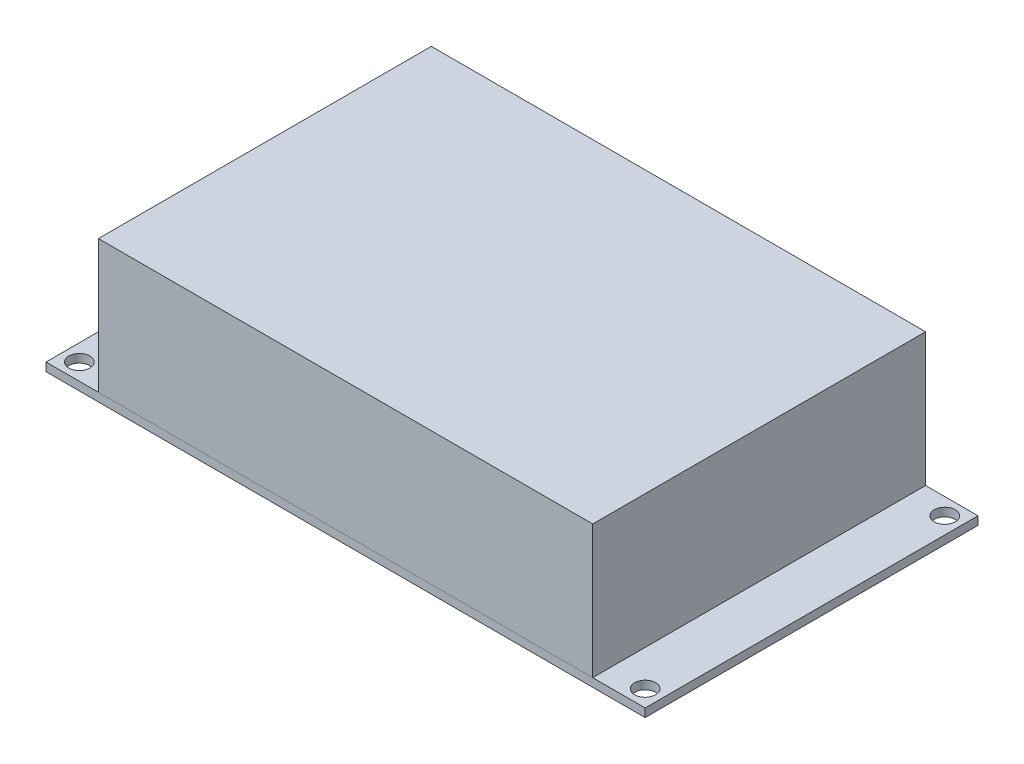
ISO-10303-21;
HEADER;
FILE_DESCRIPTION(('STEP AP214'),'2;1');
FILE_NAME('part.step','',(''),(''),'','','');
FILE_SCHEMA(('AUTOMOTIVE_DESIGN { 1 0 10303 214 1 1 1 1 }'));
ENDSEC;
DATA;
#1=APPLICATION_CONTEXT('core data for automotive mechanical design processes');
#2=APPLICATION_PROTOCOL_DEFINITION('international standard','automotive_design',2000,#1);
#3=PRODUCT_CONTEXT('',#1,'mechanical');
#4=PRODUCT('Part','Part','',(#3));
#5=PRODUCT_RELATED_PRODUCT_CATEGORY('part','',(#4));
#6=PRODUCT_DEFINITION_FORMATION('','',#4);
#7=PRODUCT_DEFINITION_CONTEXT('part definition',#1,'design');
#8=PRODUCT_DEFINITION('design','',#6,#7);
#9=PRODUCT_DEFINITION_SHAPE('','',#8);
#10=(LENGTH_UNIT() NAMED_UNIT(*) SI_UNIT(.MILLI.,.METRE.));
#11=(NAMED_UNIT(*) PLANE_ANGLE_UNIT() SI_UNIT($,.RADIAN.));
#12=(NAMED_UNIT(*) SI_UNIT($,.STERADIAN.) SOLID_ANGLE_UNIT());
#13=UNCERTAINTY_MEASURE_WITH_UNIT(LENGTH_MEASURE(1.E-05),#10,'distance_accuracy_value','');
#14=(GEOMETRIC_REPRESENTATION_CONTEXT(3) GLOBAL_UNCERTAINTY_ASSIGNED_CONTEXT((#13)) GLOBAL_UNIT_ASSIGNED_CONTEXT((#10,
#11,#12)) REPRESENTATION_CONTEXT('',''));
#15=CARTESIAN_POINT('',(0.,0.,0.));
#16=DIRECTION('',(0.,0.,1.));
#17=DIRECTION('',(1.,0.,0.));
#18=AXIS2_PLACEMENT_3D('',#15,#16,#17);
#19=CARTESIAN_POINT('',(10.,27.,0.));
#20=DIRECTION('',(0.,0.,-1.));
#21=DIRECTION('',(-1.,0.,0.));
#22=AXIS2_PLACEMENT_3D('',#19,#20,#21);
#23=PLANE('',#22);
#24=DIRECTION('',(1.,0.,0.));
#25=VECTOR('',#24,1.);
#26=CARTESIAN_POINT('',(10.,1.6,0.));
#27=LINE('',#26,#25);
#28=CARTESIAN_POINT('',(10.,1.6,0.));
#29=VERTEX_POINT('',#28);
#30=CARTESIAN_POINT('',(104.3,1.6,0.));
#31=VERTEX_POINT('',#30);
#32=EDGE_CURVE('E90',#29,#31,#27,.T.);
#33=ORIENTED_EDGE('',*,*,#32,.T.);
#34=DIRECTION('',(0.,-1.,0.));
#35=VECTOR('',#34,1.);
#36=CARTESIAN_POINT('',(104.3,27.,0.));
#37=LINE('',#36,#35);
#38=CARTESIAN_POINT('',(104.3,27.,0.));
#39=VERTEX_POINT('',#38);
#40=EDGE_CURVE('E12',#39,#31,#37,.T.);
#41=ORIENTED_EDGE('',*,*,#40,.F.);
#42=DIRECTION('',(1.,0.,0.));
#43=VECTOR('',#42,1.);
#44=CARTESIAN_POINT('',(10.,27.,0.));
#45=LINE('',#44,#43);
#46=CARTESIAN_POINT('',(10.,27.,0.));
#47=VERTEX_POINT('',#46);
#48=EDGE_CURVE('E108',#47,#39,#45,.T.);
#49=ORIENTED_EDGE('',*,*,#48,.F.);
#50=DIRECTION('',(0.,-1.,0.));
#51=VECTOR('',#50,1.);
#52=CARTESIAN_POINT('',(10.,27.,0.));
#53=LINE('',#52,#51);
#54=EDGE_CURVE('E102',#47,#29,#53,.T.);
#55=ORIENTED_EDGE('',*,*,#54,.T.);
#56=EDGE_LOOP('',(#33,#41,#49,#55));
#57=FACE_BOUND('',#56,.T.);
#58=ADVANCED_FACE('F46',(#57),#23,.F.);
#59=CARTESIAN_POINT('',(104.3,27.,-63.5));
#60=DIRECTION('',(-1.,0.,0.));
#61=DIRECTION('',(0.,0.,1.));
#62=AXIS2_PLACEMENT_3D('',#59,#60,#61);
#63=PLANE('',#62);
#64=DIRECTION('',(0.,0.,-1.));
#65=VECTOR('',#64,1.);
#66=CARTESIAN_POINT('',(104.3,1.6,-63.5));
#67=LINE('',#66,#65);
#68=CARTESIAN_POINT('',(104.3,1.6,-63.5));
#69=VERTEX_POINT('',#68);
#70=EDGE_CURVE('E86',#31,#69,#67,.T.);
#71=ORIENTED_EDGE('',*,*,#70,.T.);
#72=DIRECTION('',(0.,-1.,0.));
#73=VECTOR('',#72,1.);
#74=CARTESIAN_POINT('',(104.3,27.,-63.5));
#75=LINE('',#74,#73);
#76=CARTESIAN_POINT('',(104.3,27.,-63.5));
#77=VERTEX_POINT('',#76);
#78=EDGE_CURVE('E53',#77,#69,#75,.T.);
#79=ORIENTED_EDGE('',*,*,#78,.F.);
#80=DIRECTION('',(0.,0.,-1.));
#81=VECTOR('',#80,1.);
#82=CARTESIAN_POINT('',(104.3,27.,-63.5));
#83=LINE('',#82,#81);
#84=EDGE_CURVE('E98',#39,#77,#83,.T.);
#85=ORIENTED_EDGE('',*,*,#84,.F.);
#86=ORIENTED_EDGE('',*,*,#40,.T.);
#87=EDGE_LOOP('',(#71,#79,#85,#86));
#88=FACE_BOUND('',#87,.T.);
#89=ADVANCED_FACE('F97',(#88),#63,.F.);
#90=CARTESIAN_POINT('',(104.3,27.,-63.5));
#91=DIRECTION('',(0.,0.,1.));
#92=DIRECTION('',(1.,0.,0.));
#93=AXIS2_PLACEMENT_3D('',#90,#91,#92);
#94=PLANE('',#93);
#95=DIRECTION('',(-1.,0.,0.));
#96=VECTOR('',#95,1.);
#97=CARTESIAN_POINT('',(104.3,1.6,-63.5));
#98=LINE('',#97,#96);
#99=CARTESIAN_POINT('',(10.,1.6,-63.5));
#100=VERTEX_POINT('',#99);
#101=EDGE_CURVE('E91',#69,#100,#98,.T.);
#102=ORIENTED_EDGE('',*,*,#101,.T.);
#103=DIRECTION('',(0.,-1.,0.));
#104=VECTOR('',#103,1.);
#105=CARTESIAN_POINT('',(10.,27.,-63.5));
#106=LINE('',#105,#104);
#107=CARTESIAN_POINT('',(10.,27.,-63.5));
#108=VERTEX_POINT('',#107);
#109=EDGE_CURVE('E114',#108,#100,#106,.T.);
#110=ORIENTED_EDGE('',*,*,#109,.F.);
#111=DIRECTION('',(-1.,0.,0.));
#112=VECTOR('',#111,1.);
#113=CARTESIAN_POINT('',(104.3,27.,-63.5));
#114=LINE('',#113,#112);
#115=EDGE_CURVE('E65',#77,#108,#114,.T.);
#116=ORIENTED_EDGE('',*,*,#115,.F.);
#117=ORIENTED_EDGE('',*,*,#78,.T.);
#118=EDGE_LOOP('',(#102,#110,#116,#117));
#119=FACE_BOUND('',#118,.T.);
#120=ADVANCED_FACE('F117',(#119),#94,.F.);
#121=CARTESIAN_POINT('',(10.,27.,-63.5));
#122=DIRECTION('',(1.,0.,0.));
#123=DIRECTION('',(0.,0.,-1.));
#124=AXIS2_PLACEMENT_3D('',#121,#122,#123);
#125=PLANE('',#124);
#126=DIRECTION('',(0.,0.,1.));
#127=VECTOR('',#126,1.);
#128=CARTESIAN_POINT('',(10.,1.6,-63.5));
#129=LINE('',#128,#127);
#130=EDGE_CURVE('E106',#100,#29,#129,.T.);
#131=ORIENTED_EDGE('',*,*,#130,.T.);
#132=ORIENTED_EDGE('',*,*,#54,.F.);
#133=DIRECTION('',(0.,0.,1.));
#134=VECTOR('',#133,1.);
#135=CARTESIAN_POINT('',(10.,27.,-63.5));
#136=LINE('',#135,#134);
#137=EDGE_CURVE('E60',#108,#47,#136,.T.);
#138=ORIENTED_EDGE('',*,*,#137,.F.);
#139=ORIENTED_EDGE('',*,*,#109,.T.);
#140=EDGE_LOOP('',(#131,#132,#138,#139));
#141=FACE_BOUND('',#140,.T.);
#142=ADVANCED_FACE('F119',(#141),#125,.F.);
#143=CARTESIAN_POINT('',(104.3,27.,0.));
#144=DIRECTION('',(0.,-1.,0.));
#145=DIRECTION('',(0.,0.,-1.));
#146=AXIS2_PLACEMENT_3D('',#143,#144,#145);
#147=PLANE('',#146);
#148=ORIENTED_EDGE('',*,*,#48,.T.);
#149=ORIENTED_EDGE('',*,*,#84,.T.);
#150=ORIENTED_EDGE('',*,*,#115,.T.);
#151=ORIENTED_EDGE('',*,*,#137,.T.);
#152=EDGE_LOOP('',(#148,#149,#150,#151));
#153=FACE_BOUND('',#152,.T.);
#154=ADVANCED_FACE('F120',(#153),#147,.F.);
#155=CARTESIAN_POINT('',(104.3,1.6,0.));
#156=DIRECTION('',(0.,-1.,0.));
#157=DIRECTION('',(0.,0.,-1.));
#158=AXIS2_PLACEMENT_3D('',#155,#156,#157);
#159=PLANE('',#158);
#160=ORIENTED_EDGE('',*,*,#32,.F.);
#161=ORIENTED_EDGE('',*,*,#130,.F.);
#162=ORIENTED_EDGE('',*,*,#101,.F.);
#163=ORIENTED_EDGE('',*,*,#70,.F.);
#164=EDGE_LOOP('',(#160,#161,#162,#163));
#165=FACE_BOUND('',#164,.T.);
#166=ADVANCED_FACE('F87',(#165),#159,.T.);
#167=CLOSED_SHELL('',(#58,#89,#120,#142,#154,#166));
#168=MANIFOLD_SOLID_BREP('B2',#167);
#169=CARTESIAN_POINT('',(0.,1.6,0.));
#170=DIRECTION('',(1.,0.,0.));
#171=DIRECTION('',(0.,0.,-1.));
#172=AXIS2_PLACEMENT_3D('',#169,#170,#171);
#173=PLANE('',#172);
#174=DIRECTION('',(0.,0.,1.));
#175=VECTOR('',#174,1.);
#176=CARTESIAN_POINT('',(0.,0.,0.));
#177=LINE('',#176,#175);
#178=CARTESIAN_POINT('',(0.,0.,-63.5));
#179=VERTEX_POINT('',#178);
#180=CARTESIAN_POINT('',(0.,0.,0.));
#181=VERTEX_POINT('',#180);
#182=EDGE_CURVE('E213',#179,#181,#177,.T.);
#183=ORIENTED_EDGE('',*,*,#182,.T.);
#184=DIRECTION('',(0.,-1.,0.));
#185=VECTOR('',#184,1.);
#186=CARTESIAN_POINT('',(0.,1.6,0.));
#187=LINE('',#186,#185);
#188=CARTESIAN_POINT('',(0.,1.6,0.));
#189=VERTEX_POINT('',#188);
#190=EDGE_CURVE('E44',#189,#181,#187,.T.);
#191=ORIENTED_EDGE('',*,*,#190,.F.);
#192=DIRECTION('',(0.,0.,1.));
#193=VECTOR('',#192,1.);
#194=CARTESIAN_POINT('',(0.,1.6,0.));
#195=LINE('',#194,#193);
#196=CARTESIAN_POINT('',(0.,1.6,-63.5));
#197=VERTEX_POINT('',#196);
#198=EDGE_CURVE('E236',#197,#189,#195,.T.);
#199=ORIENTED_EDGE('',*,*,#198,.F.);
#200=DIRECTION('',(0.,-1.,0.));
#201=VECTOR('',#200,1.);
#202=CARTESIAN_POINT('',(0.,1.6,-63.5));
#203=LINE('',#202,#201);
#204=EDGE_CURVE('E225',#197,#179,#203,.T.);
#205=ORIENTED_EDGE('',*,*,#204,.T.);
#206=EDGE_LOOP('',(#183,#191,#199,#205));
#207=FACE_BOUND('',#206,.T.);
#208=ADVANCED_FACE('F169',(#207),#173,.F.);
#209=CARTESIAN_POINT('',(0.,1.6,0.));
#210=DIRECTION('',(0.,0.,-1.));
#211=DIRECTION('',(-1.,0.,0.));
#212=AXIS2_PLACEMENT_3D('',#209,#210,#211);
#213=PLANE('',#212);
#214=DIRECTION('',(1.,0.,0.));
#215=VECTOR('',#214,1.);
#216=CARTESIAN_POINT('',(0.,0.,0.));
#217=LINE('',#216,#215);
#218=CARTESIAN_POINT('',(114.3,0.,0.));
#219=VERTEX_POINT('',#218);
#220=EDGE_CURVE('E209',#181,#219,#217,.T.);
#221=ORIENTED_EDGE('',*,*,#220,.T.);
#222=DIRECTION('',(0.,-1.,0.));
#223=VECTOR('',#222,1.);
#224=CARTESIAN_POINT('',(114.3,1.6,0.));
#225=LINE('',#224,#223);
#226=CARTESIAN_POINT('',(114.3,1.6,0.));
#227=VERTEX_POINT('',#226);
#228=EDGE_CURVE('E176',#227,#219,#225,.T.);
#229=ORIENTED_EDGE('',*,*,#228,.F.);
#230=DIRECTION('',(1.,0.,0.));
#231=VECTOR('',#230,1.);
#232=CARTESIAN_POINT('',(0.,1.6,0.));
#233=LINE('',#232,#231);
#234=EDGE_CURVE('E221',#189,#227,#233,.T.);
#235=ORIENTED_EDGE('',*,*,#234,.F.);
#236=ORIENTED_EDGE('',*,*,#190,.T.);
#237=EDGE_LOOP('',(#221,#229,#235,#236));
#238=FACE_BOUND('',#237,.T.);
#239=ADVANCED_FACE('F220',(#238),#213,.F.);
#240=CARTESIAN_POINT('',(114.3,1.6,0.));
#241=DIRECTION('',(-1.,0.,0.));
#242=DIRECTION('',(0.,0.,1.));
#243=AXIS2_PLACEMENT_3D('',#240,#241,#242);
#244=PLANE('',#243);
#245=DIRECTION('',(0.,0.,-1.));
#246=VECTOR('',#245,1.);
#247=CARTESIAN_POINT('',(114.3,0.,0.));
#248=LINE('',#247,#246);
#249=CARTESIAN_POINT('',(114.3,0.,-63.5));
#250=VERTEX_POINT('',#249);
#251=EDGE_CURVE('E214',#219,#250,#248,.T.);
#252=ORIENTED_EDGE('',*,*,#251,.T.);
#253=DIRECTION('',(0.,-1.,0.));
#254=VECTOR('',#253,1.);
#255=CARTESIAN_POINT('',(114.3,1.6,-63.5));
#256=LINE('',#255,#254);
#257=CARTESIAN_POINT('',(114.3,1.6,-63.5));
#258=VERTEX_POINT('',#257);
#259=EDGE_CURVE('E242',#258,#250,#256,.T.);
#260=ORIENTED_EDGE('',*,*,#259,.F.);
#261=DIRECTION('',(0.,0.,-1.));
#262=VECTOR('',#261,1.);
#263=CARTESIAN_POINT('',(114.3,1.6,0.));
#264=LINE('',#263,#262);
#265=EDGE_CURVE('E188',#227,#258,#264,.T.);
#266=ORIENTED_EDGE('',*,*,#265,.F.);
#267=ORIENTED_EDGE('',*,*,#228,.T.);
#268=EDGE_LOOP('',(#252,#260,#266,#267));
#269=FACE_BOUND('',#268,.T.);
#270=ADVANCED_FACE('F245',(#269),#244,.F.);
#271=CARTESIAN_POINT('',(0.,1.6,-63.5));
#272=DIRECTION('',(0.,0.,1.));
#273=DIRECTION('',(1.,0.,0.));
#274=AXIS2_PLACEMENT_3D('',#271,#272,#273);
#275=PLANE('',#274);
#276=DIRECTION('',(-1.,0.,0.));
#277=VECTOR('',#276,1.);
#278=CARTESIAN_POINT('',(0.,0.,-63.5));
#279=LINE('',#278,#277);
#280=EDGE_CURVE('E234',#250,#179,#279,.T.);
#281=ORIENTED_EDGE('',*,*,#280,.T.);
#282=ORIENTED_EDGE('',*,*,#204,.F.);
#283=DIRECTION('',(-1.,0.,0.));
#284=VECTOR('',#283,1.);
#285=CARTESIAN_POINT('',(0.,1.6,-63.5));
#286=LINE('',#285,#284);
#287=EDGE_CURVE('E183',#258,#197,#286,.T.);
#288=ORIENTED_EDGE('',*,*,#287,.F.);
#289=ORIENTED_EDGE('',*,*,#259,.T.);
#290=EDGE_LOOP('',(#281,#282,#288,#289));
#291=FACE_BOUND('',#290,.T.);
#292=ADVANCED_FACE('F247',(#291),#275,.F.);
#293=CARTESIAN_POINT('',(0.,1.6,-63.5));
#294=DIRECTION('',(0.,-1.,0.));
#295=DIRECTION('',(0.,0.,-1.));
#296=AXIS2_PLACEMENT_3D('',#293,#294,#295);
#297=PLANE('',#296);
#298=CARTESIAN_POINT('',(111.125,1.6,-3.17500000000001));
#299=DIRECTION('',(0.,1.,0.));
#300=DIRECTION('',(0.,0.,1.));
#301=AXIS2_PLACEMENT_3D('',#298,#299,#300);
#302=CIRCLE('',#301,2.);
#303=CARTESIAN_POINT('',(111.125,1.6,-1.17500000000002));
#304=VERTEX_POINT('',#303);
#305=EDGE_CURVE('E334',#304,#304,#302,.T.);
#306=ORIENTED_EDGE('',*,*,#305,.F.);
#307=EDGE_LOOP('',(#306));
#308=FACE_BOUND('',#307,.T.);
#309=CARTESIAN_POINT('',(111.125,1.6,-60.325));
#310=DIRECTION('',(0.,1.,0.));
#311=DIRECTION('',(0.,0.,1.));
#312=AXIS2_PLACEMENT_3D('',#309,#310,#311);
#313=CIRCLE('',#312,2.);
#314=CARTESIAN_POINT('',(111.125,1.6,-58.325));
#315=VERTEX_POINT('',#314);
#316=EDGE_CURVE('E336',#315,#315,#313,.T.);
#317=ORIENTED_EDGE('',*,*,#316,.F.);
#318=EDGE_LOOP('',(#317));
#319=FACE_BOUND('',#318,.T.);
#320=CARTESIAN_POINT('',(3.175,1.6,-3.175));
#321=DIRECTION('',(0.,1.,0.));
#322=DIRECTION('',(0.,0.,1.));
#323=AXIS2_PLACEMENT_3D('',#320,#321,#322);
#324=CIRCLE('',#323,2.);
#325=CARTESIAN_POINT('',(3.175,1.6,-1.175));
#326=VERTEX_POINT('',#325);
#327=EDGE_CURVE('E344',#326,#326,#324,.T.);
#328=ORIENTED_EDGE('',*,*,#327,.F.);
#329=EDGE_LOOP('',(#328));
#330=FACE_BOUND('',#329,.T.);
#331=CARTESIAN_POINT('',(3.175,1.6,-60.325));
#332=DIRECTION('',(0.,1.,0.));
#333=DIRECTION('',(0.,0.,1.));
#334=AXIS2_PLACEMENT_3D('',#331,#332,#333);
#335=CIRCLE('',#334,2.);
#336=CARTESIAN_POINT('',(3.175,1.6,-58.325));
#337=VERTEX_POINT('',#336);
#338=EDGE_CURVE('E229',#337,#337,#335,.T.);
#339=ORIENTED_EDGE('',*,*,#338,.F.);
#340=EDGE_LOOP('',(#339));
#341=FACE_BOUND('',#340,.T.);
#342=ORIENTED_EDGE('',*,*,#198,.T.);
#343=ORIENTED_EDGE('',*,*,#234,.T.);
#344=ORIENTED_EDGE('',*,*,#265,.T.);
#345=ORIENTED_EDGE('',*,*,#287,.T.);
#346=EDGE_LOOP('',(#342,#343,#344,#345));
#347=FACE_BOUND('',#346,.T.);
#348=ADVANCED_FACE('F248',(#308,#319,#330,#341,#347),#297,.F.);
#349=CARTESIAN_POINT('',(0.,0.,-63.5));
#350=DIRECTION('',(0.,-1.,0.));
#351=DIRECTION('',(0.,0.,-1.));
#352=AXIS2_PLACEMENT_3D('',#349,#350,#351);
#353=PLANE('',#352);
#354=CARTESIAN_POINT('',(111.125,0.,-3.17500000000001));
#355=DIRECTION('',(0.,1.,0.));
#356=DIRECTION('',(0.,0.,1.));
#357=AXIS2_PLACEMENT_3D('',#354,#355,#356);
#358=CIRCLE('',#357,2.);
#359=CARTESIAN_POINT('',(111.125,0.,-1.17500000000002));
#360=VERTEX_POINT('',#359);
#361=EDGE_CURVE('E332',#360,#360,#358,.T.);
#362=ORIENTED_EDGE('',*,*,#361,.T.);
#363=EDGE_LOOP('',(#362));
#364=FACE_BOUND('',#363,.T.);
#365=CARTESIAN_POINT('',(111.125,0.,-60.325));
#366=DIRECTION('',(0.,1.,0.));
#367=DIRECTION('',(0.,0.,1.));
#368=AXIS2_PLACEMENT_3D('',#365,#366,#367);
#369=CIRCLE('',#368,2.);
#370=CARTESIAN_POINT('',(111.125,0.,-58.325));
#371=VERTEX_POINT('',#370);
#372=EDGE_CURVE('E341',#371,#371,#369,.T.);
#373=ORIENTED_EDGE('',*,*,#372,.T.);
#374=EDGE_LOOP('',(#373));
#375=FACE_BOUND('',#374,.T.);
#376=CARTESIAN_POINT('',(3.175,0.,-3.175));
#377=DIRECTION('',(0.,1.,0.));
#378=DIRECTION('',(0.,0.,1.));
#379=AXIS2_PLACEMENT_3D('',#376,#377,#378);
#380=CIRCLE('',#379,2.);
#381=CARTESIAN_POINT('',(3.175,0.,-1.175));
#382=VERTEX_POINT('',#381);
#383=EDGE_CURVE('E347',#382,#382,#380,.T.);
#384=ORIENTED_EDGE('',*,*,#383,.T.);
#385=EDGE_LOOP('',(#384));
#386=FACE_BOUND('',#385,.T.);
#387=CARTESIAN_POINT('',(3.175,0.,-60.325));
#388=DIRECTION('',(0.,1.,0.));
#389=DIRECTION('',(0.,0.,1.));
#390=AXIS2_PLACEMENT_3D('',#387,#388,#389);
#391=CIRCLE('',#390,2.);
#392=CARTESIAN_POINT('',(3.175,0.,-58.325));
#393=VERTEX_POINT('',#392);
#394=EDGE_CURVE('E226',#393,#393,#391,.T.);
#395=ORIENTED_EDGE('',*,*,#394,.T.);
#396=EDGE_LOOP('',(#395));
#397=FACE_BOUND('',#396,.T.);
#398=ORIENTED_EDGE('',*,*,#182,.F.);
#399=ORIENTED_EDGE('',*,*,#280,.F.);
#400=ORIENTED_EDGE('',*,*,#251,.F.);
#401=ORIENTED_EDGE('',*,*,#220,.F.);
#402=EDGE_LOOP('',(#398,#399,#400,#401));
#403=FACE_BOUND('',#402,.T.);
#404=ADVANCED_FACE('F210',(#364,#375,#386,#397,#403),#353,.T.);
#405=CARTESIAN_POINT('',(3.175,0.,-60.325));
#406=DIRECTION('',(0.,1.,0.));
#407=DIRECTION('',(0.,0.,1.));
#408=AXIS2_PLACEMENT_3D('',#405,#406,#407);
#409=CYLINDRICAL_SURFACE('',#408,2.);
#410=ORIENTED_EDGE('',*,*,#394,.F.);
#411=EDGE_LOOP('',(#410));
#412=FACE_BOUND('',#411,.T.);
#413=ORIENTED_EDGE('',*,*,#338,.T.);
#414=EDGE_LOOP('',(#413));
#415=FACE_BOUND('',#414,.T.);
#416=ADVANCED_FACE('F256',(#412,#415),#409,.F.);
#417=CARTESIAN_POINT('',(3.175,0.,-3.175));
#418=DIRECTION('',(0.,1.,0.));
#419=DIRECTION('',(0.,0.,1.));
#420=AXIS2_PLACEMENT_3D('',#417,#418,#419);
#421=CYLINDRICAL_SURFACE('',#420,2.);
#422=ORIENTED_EDGE('',*,*,#383,.F.);
#423=EDGE_LOOP('',(#422));
#424=FACE_BOUND('',#423,.T.);
#425=ORIENTED_EDGE('',*,*,#327,.T.);
#426=EDGE_LOOP('',(#425));
#427=FACE_BOUND('',#426,.T.);
#428=ADVANCED_FACE('F295',(#424,#427),#421,.F.);
#429=CARTESIAN_POINT('',(111.125,0.,-60.325));
#430=DIRECTION('',(0.,1.,0.));
#431=DIRECTION('',(0.,0.,1.));
#432=AXIS2_PLACEMENT_3D('',#429,#430,#431);
#433=CYLINDRICAL_SURFACE('',#432,2.);
#434=ORIENTED_EDGE('',*,*,#372,.F.);
#435=EDGE_LOOP('',(#434));
#436=FACE_BOUND('',#435,.T.);
#437=ORIENTED_EDGE('',*,*,#316,.T.);
#438=EDGE_LOOP('',(#437));
#439=FACE_BOUND('',#438,.T.);
#440=ADVANCED_FACE('F305',(#436,#439),#433,.F.);
#441=CARTESIAN_POINT('',(111.125,0.,-3.17500000000001));
#442=DIRECTION('',(0.,1.,0.));
#443=DIRECTION('',(0.,0.,1.));
#444=AXIS2_PLACEMENT_3D('',#441,#442,#443);
#445=CYLINDRICAL_SURFACE('',#444,2.);
#446=ORIENTED_EDGE('',*,*,#361,.F.);
#447=EDGE_LOOP('',(#446));
#448=FACE_BOUND('',#447,.T.);
#449=ORIENTED_EDGE('',*,*,#305,.T.);
#450=EDGE_LOOP('',(#449));
#451=FACE_BOUND('',#450,.T.);
#452=ADVANCED_FACE('F315',(#448,#451),#445,.F.);
#453=CLOSED_SHELL('',(#208,#239,#270,#292,#348,#404,#416,#428,#440,#452));
#454=MANIFOLD_SOLID_BREP('B6',#453);
#455=ADVANCED_BREP_SHAPE_REPRESENTATION('',(#18,#168,#454),#14);
#456=SHAPE_DEFINITION_REPRESENTATION(#9,#455);
ENDSEC;
END-ISO-10303-21;
